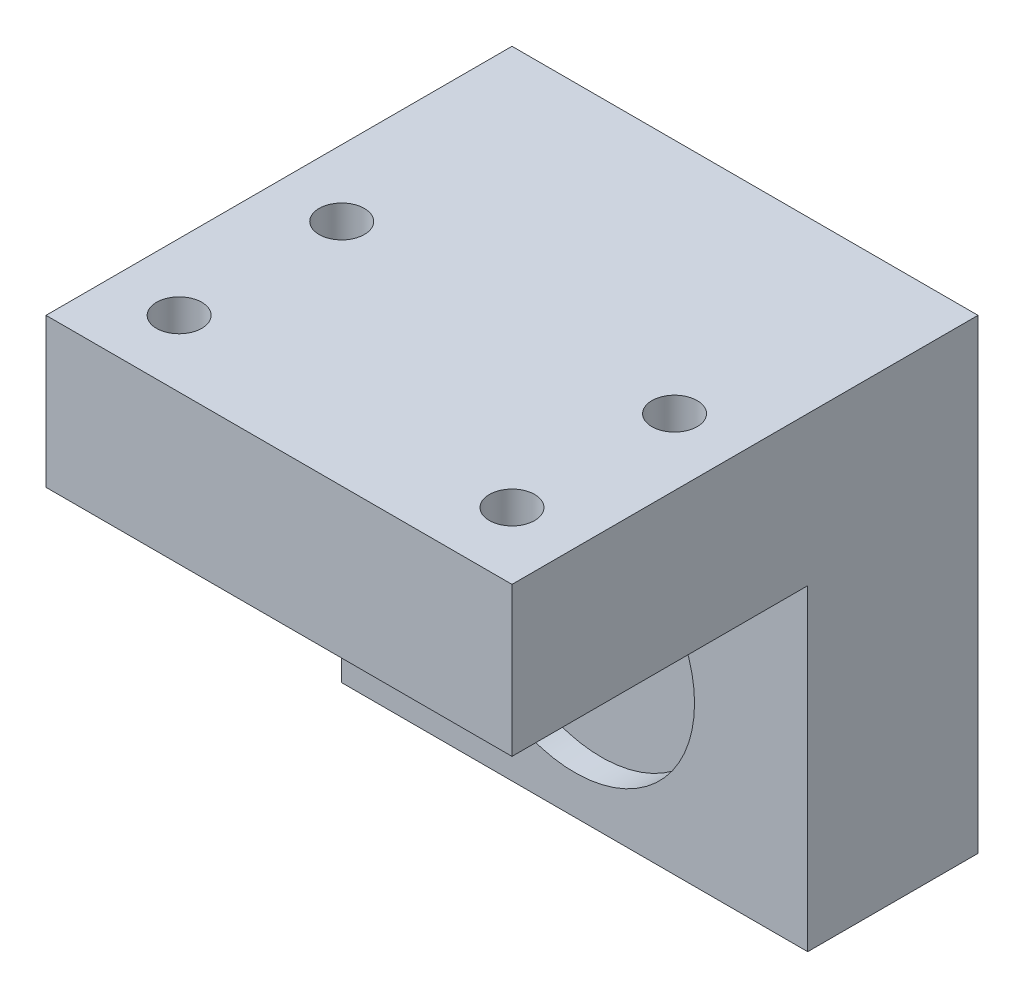
ISO-10303-21;
HEADER;
FILE_DESCRIPTION(('STEP AP214'),'2;1');
FILE_NAME('part.step','',(''),(''),'','','');
FILE_SCHEMA(('AUTOMOTIVE_DESIGN { 1 0 10303 214 1 1 1 1 }'));
ENDSEC;
DATA;
#1=APPLICATION_CONTEXT('core data for automotive mechanical design processes');
#2=APPLICATION_PROTOCOL_DEFINITION('international standard','automotive_design',2000,#1);
#3=PRODUCT_CONTEXT('',#1,'mechanical');
#4=PRODUCT('Part','Part','',(#3));
#5=PRODUCT_RELATED_PRODUCT_CATEGORY('part','',(#4));
#6=PRODUCT_DEFINITION_FORMATION('','',#4);
#7=PRODUCT_DEFINITION_CONTEXT('part definition',#1,'design');
#8=PRODUCT_DEFINITION('design','',#6,#7);
#9=PRODUCT_DEFINITION_SHAPE('','',#8);
#10=(LENGTH_UNIT() NAMED_UNIT(*) SI_UNIT(.MILLI.,.METRE.));
#11=(NAMED_UNIT(*) PLANE_ANGLE_UNIT() SI_UNIT($,.RADIAN.));
#12=(NAMED_UNIT(*) SI_UNIT($,.STERADIAN.) SOLID_ANGLE_UNIT());
#13=UNCERTAINTY_MEASURE_WITH_UNIT(LENGTH_MEASURE(1.E-05),#10,'distance_accuracy_value','');
#14=(GEOMETRIC_REPRESENTATION_CONTEXT(3) GLOBAL_UNCERTAINTY_ASSIGNED_CONTEXT((#13)) GLOBAL_UNIT_ASSIGNED_CONTEXT((#10,
#11,#12)) REPRESENTATION_CONTEXT('',''));
#15=CARTESIAN_POINT('',(0.,0.,0.));
#16=DIRECTION('',(0.,0.,1.));
#17=DIRECTION('',(1.,0.,0.));
#18=AXIS2_PLACEMENT_3D('',#15,#16,#17);
#19=CARTESIAN_POINT('',(17.5,11.905,-12.791));
#20=DIRECTION('',(0.,0.,1.));
#21=DIRECTION('',(1.,0.,0.));
#22=AXIS2_PLACEMENT_3D('',#19,#20,#21);
#23=CYLINDRICAL_SURFACE('',#22,3.);
#24=CARTESIAN_POINT('',(17.5,11.905,-12.79));
#25=DIRECTION('',(0.,0.,1.));
#26=DIRECTION('',(0.,-1.,0.));
#27=AXIS2_PLACEMENT_3D('',#24,#25,#26);
#28=CIRCLE('',#27,3.);
#29=CARTESIAN_POINT('',(17.5,8.905,-12.79));
#30=VERTEX_POINT('',#29);
#31=EDGE_CURVE('E141',#30,#30,#28,.F.);
#32=ORIENTED_EDGE('',*,*,#31,.T.);
#33=EDGE_LOOP('',(#32));
#34=FACE_BOUND('',#33,.T.);
#35=CARTESIAN_POINT('',(17.5,11.905,-2.));
#36=DIRECTION('',(0.,0.,1.));
#37=DIRECTION('',(1.,0.,0.));
#38=AXIS2_PLACEMENT_3D('',#35,#36,#37);
#39=CIRCLE('',#38,3.);
#40=CARTESIAN_POINT('',(20.5,11.905,-2.));
#41=VERTEX_POINT('',#40);
#42=EDGE_CURVE('E49',#41,#41,#39,.F.);
#43=ORIENTED_EDGE('',*,*,#42,.F.);
#44=EDGE_LOOP('',(#43));
#45=FACE_BOUND('',#44,.T.);
#46=ADVANCED_FACE('F45',(#34,#45),#23,.F.);
#47=CARTESIAN_POINT('',(35.,35.,22.21));
#48=DIRECTION('',(0.,0.,-1.));
#49=DIRECTION('',(0.,1.,0.));
#50=AXIS2_PLACEMENT_3D('',#47,#48,#49);
#51=PLANE('',#50);
#52=DIRECTION('',(0.,-1.,0.));
#53=VECTOR('',#52,1.);
#54=CARTESIAN_POINT('',(0.,35.,22.21));
#55=LINE('',#54,#53);
#56=CARTESIAN_POINT('',(0.,35.,22.21));
#57=VERTEX_POINT('',#56);
#58=CARTESIAN_POINT('',(0.,23.81,22.21));
#59=VERTEX_POINT('',#58);
#60=EDGE_CURVE('E136',#57,#59,#55,.T.);
#61=ORIENTED_EDGE('',*,*,#60,.T.);
#62=DIRECTION('',(-1.,0.,0.));
#63=VECTOR('',#62,1.);
#64=CARTESIAN_POINT('',(35.,23.81,22.21));
#65=LINE('',#64,#63);
#66=CARTESIAN_POINT('',(35.,23.81,22.21));
#67=VERTEX_POINT('',#66);
#68=EDGE_CURVE('E11',#67,#59,#65,.T.);
#69=ORIENTED_EDGE('',*,*,#68,.F.);
#70=DIRECTION('',(0.,-1.,0.));
#71=VECTOR('',#70,1.);
#72=CARTESIAN_POINT('',(35.,35.,22.21));
#73=LINE('',#72,#71);
#74=CARTESIAN_POINT('',(35.,35.,22.21));
#75=VERTEX_POINT('',#74);
#76=EDGE_CURVE('E153',#75,#67,#73,.T.);
#77=ORIENTED_EDGE('',*,*,#76,.F.);
#78=DIRECTION('',(-1.,0.,0.));
#79=VECTOR('',#78,1.);
#80=CARTESIAN_POINT('',(35.,35.,22.21));
#81=LINE('',#80,#79);
#82=EDGE_CURVE('E132',#75,#57,#81,.T.);
#83=ORIENTED_EDGE('',*,*,#82,.T.);
#84=EDGE_LOOP('',(#61,#69,#77,#83));
#85=FACE_BOUND('',#84,.T.);
#86=ADVANCED_FACE('F47',(#85),#51,.F.);
#87=CARTESIAN_POINT('',(35.,23.81,22.21));
#88=DIRECTION('',(0.,1.,0.));
#89=DIRECTION('',(0.,0.,1.));
#90=AXIS2_PLACEMENT_3D('',#87,#88,#89);
#91=PLANE('',#90);
#92=CARTESIAN_POINT('',(5.,23.81,5.00000000000001));
#93=DIRECTION('',(0.,-1.,0.));
#94=DIRECTION('',(0.,0.,-1.));
#95=AXIS2_PLACEMENT_3D('',#92,#93,#94);
#96=CIRCLE('',#95,1.7);
#97=CARTESIAN_POINT('',(5.,23.81,3.30000000000001));
#98=VERTEX_POINT('',#97);
#99=EDGE_CURVE('E250',#98,#98,#96,.T.);
#100=ORIENTED_EDGE('',*,*,#99,.F.);
#101=EDGE_LOOP('',(#100));
#102=FACE_BOUND('',#101,.T.);
#103=CARTESIAN_POINT('',(30.,23.81,5.00000000000001));
#104=DIRECTION('',(0.,-1.,0.));
#105=DIRECTION('',(0.,0.,-1.));
#106=AXIS2_PLACEMENT_3D('',#103,#104,#105);
#107=CIRCLE('',#106,1.69999999999999);
#108=CARTESIAN_POINT('',(30.,23.81,3.30000000000002));
#109=VERTEX_POINT('',#108);
#110=EDGE_CURVE('E238',#109,#109,#107,.T.);
#111=ORIENTED_EDGE('',*,*,#110,.F.);
#112=EDGE_LOOP('',(#111));
#113=FACE_BOUND('',#112,.T.);
#114=CARTESIAN_POINT('',(30.,23.81,17.21));
#115=DIRECTION('',(0.,-1.,0.));
#116=DIRECTION('',(0.,0.,-1.));
#117=AXIS2_PLACEMENT_3D('',#114,#115,#116);
#118=CIRCLE('',#117,1.7);
#119=CARTESIAN_POINT('',(30.,23.81,15.51));
#120=VERTEX_POINT('',#119);
#121=EDGE_CURVE('E232',#120,#120,#118,.T.);
#122=ORIENTED_EDGE('',*,*,#121,.F.);
#123=EDGE_LOOP('',(#122));
#124=FACE_BOUND('',#123,.T.);
#125=CARTESIAN_POINT('',(5.,23.81,17.21));
#126=DIRECTION('',(0.,-1.,0.));
#127=DIRECTION('',(0.,0.,-1.));
#128=AXIS2_PLACEMENT_3D('',#125,#126,#127);
#129=CIRCLE('',#128,1.7);
#130=CARTESIAN_POINT('',(5.,23.81,15.51));
#131=VERTEX_POINT('',#130);
#132=EDGE_CURVE('E242',#131,#131,#129,.T.);
#133=ORIENTED_EDGE('',*,*,#132,.F.);
#134=EDGE_LOOP('',(#133));
#135=FACE_BOUND('',#134,.T.);
#136=DIRECTION('',(0.,0.,-1.));
#137=VECTOR('',#136,1.);
#138=CARTESIAN_POINT('',(0.,23.81,22.21));
#139=LINE('',#138,#137);
#140=CARTESIAN_POINT('',(0.,23.81,0.));
#141=VERTEX_POINT('',#140);
#142=EDGE_CURVE('E140',#59,#141,#139,.T.);
#143=ORIENTED_EDGE('',*,*,#142,.T.);
#144=DIRECTION('',(-1.,0.,0.));
#145=VECTOR('',#144,1.);
#146=CARTESIAN_POINT('',(35.,23.81,0.));
#147=LINE('',#146,#145);
#148=CARTESIAN_POINT('',(35.,23.81,0.));
#149=VERTEX_POINT('',#148);
#150=EDGE_CURVE('E56',#149,#141,#147,.T.);
#151=ORIENTED_EDGE('',*,*,#150,.F.);
#152=DIRECTION('',(0.,0.,-1.));
#153=VECTOR('',#152,1.);
#154=CARTESIAN_POINT('',(35.,23.81,22.21));
#155=LINE('',#154,#153);
#156=EDGE_CURVE('E101',#67,#149,#155,.T.);
#157=ORIENTED_EDGE('',*,*,#156,.F.);
#158=ORIENTED_EDGE('',*,*,#68,.T.);
#159=EDGE_LOOP('',(#143,#151,#157,#158));
#160=FACE_BOUND('',#159,.T.);
#161=ADVANCED_FACE('F194',(#102,#113,#124,#135,#160),#91,.F.);
#162=CARTESIAN_POINT('',(35.,23.81,0.));
#163=DIRECTION('',(0.,0.,-1.));
#164=DIRECTION('',(0.,1.,0.));
#165=AXIS2_PLACEMENT_3D('',#162,#163,#164);
#166=PLANE('',#165);
#167=CARTESIAN_POINT('',(17.5,11.905,0.));
#168=DIRECTION('',(0.,0.,1.));
#169=DIRECTION('',(1.,0.,0.));
#170=AXIS2_PLACEMENT_3D('',#167,#168,#169);
#171=CIRCLE('',#170,9.);
#172=CARTESIAN_POINT('',(26.5,11.905,0.));
#173=VERTEX_POINT('',#172);
#174=EDGE_CURVE('E266',#173,#173,#171,.T.);
#175=ORIENTED_EDGE('',*,*,#174,.F.);
#176=EDGE_LOOP('',(#175));
#177=FACE_BOUND('',#176,.T.);
#178=DIRECTION('',(0.,-1.,0.));
#179=VECTOR('',#178,1.);
#180=CARTESIAN_POINT('',(0.,23.81,0.));
#181=LINE('',#180,#179);
#182=CARTESIAN_POINT('',(0.,0.,0.));
#183=VERTEX_POINT('',#182);
#184=EDGE_CURVE('E144',#141,#183,#181,.T.);
#185=ORIENTED_EDGE('',*,*,#184,.T.);
#186=DIRECTION('',(-1.,0.,0.));
#187=VECTOR('',#186,1.);
#188=CARTESIAN_POINT('',(35.,0.,0.));
#189=LINE('',#188,#187);
#190=CARTESIAN_POINT('',(35.,0.,0.));
#191=VERTEX_POINT('',#190);
#192=EDGE_CURVE('E125',#191,#183,#189,.T.);
#193=ORIENTED_EDGE('',*,*,#192,.F.);
#194=DIRECTION('',(0.,-1.,0.));
#195=VECTOR('',#194,1.);
#196=CARTESIAN_POINT('',(35.,23.81,0.));
#197=LINE('',#196,#195);
#198=EDGE_CURVE('E114',#149,#191,#197,.T.);
#199=ORIENTED_EDGE('',*,*,#198,.F.);
#200=ORIENTED_EDGE('',*,*,#150,.T.);
#201=EDGE_LOOP('',(#185,#193,#199,#200));
#202=FACE_BOUND('',#201,.T.);
#203=ADVANCED_FACE('F164',(#177,#202),#166,.F.);
#204=CARTESIAN_POINT('',(35.,0.,0.));
#205=DIRECTION('',(0.,1.,0.));
#206=DIRECTION('',(0.,0.,1.));
#207=AXIS2_PLACEMENT_3D('',#204,#205,#206);
#208=PLANE('',#207);
#209=DIRECTION('',(0.,0.,-1.));
#210=VECTOR('',#209,1.);
#211=CARTESIAN_POINT('',(0.,0.,0.));
#212=LINE('',#211,#210);
#213=CARTESIAN_POINT('',(0.,0.,-12.79));
#214=VERTEX_POINT('',#213);
#215=EDGE_CURVE('E123',#183,#214,#212,.T.);
#216=ORIENTED_EDGE('',*,*,#215,.T.);
#217=DIRECTION('',(-1.,0.,0.));
#218=VECTOR('',#217,1.);
#219=CARTESIAN_POINT('',(35.,0.,-12.79));
#220=LINE('',#219,#218);
#221=CARTESIAN_POINT('',(35.,0.,-12.79));
#222=VERTEX_POINT('',#221);
#223=EDGE_CURVE('E120',#222,#214,#220,.T.);
#224=ORIENTED_EDGE('',*,*,#223,.F.);
#225=DIRECTION('',(0.,0.,-1.));
#226=VECTOR('',#225,1.);
#227=CARTESIAN_POINT('',(35.,0.,0.));
#228=LINE('',#227,#226);
#229=EDGE_CURVE('E108',#191,#222,#228,.T.);
#230=ORIENTED_EDGE('',*,*,#229,.F.);
#231=ORIENTED_EDGE('',*,*,#192,.T.);
#232=EDGE_LOOP('',(#216,#224,#230,#231));
#233=FACE_BOUND('',#232,.T.);
#234=ADVANCED_FACE('F121',(#233),#208,.F.);
#235=CARTESIAN_POINT('',(35.,0.,-12.79));
#236=DIRECTION('',(0.,0.,1.));
#237=DIRECTION('',(0.,-1.,0.));
#238=AXIS2_PLACEMENT_3D('',#235,#236,#237);
#239=PLANE('',#238);
#240=ORIENTED_EDGE('',*,*,#31,.F.);
#241=EDGE_LOOP('',(#240));
#242=FACE_BOUND('',#241,.T.);
#243=DIRECTION('',(0.,1.,0.));
#244=VECTOR('',#243,1.);
#245=CARTESIAN_POINT('',(0.,0.,-12.79));
#246=LINE('',#245,#244);
#247=CARTESIAN_POINT('',(0.,35.,-12.79));
#248=VERTEX_POINT('',#247);
#249=EDGE_CURVE('E87',#214,#248,#246,.T.);
#250=ORIENTED_EDGE('',*,*,#249,.T.);
#251=DIRECTION('',(-1.,0.,0.));
#252=VECTOR('',#251,1.);
#253=CARTESIAN_POINT('',(35.,35.,-12.79));
#254=LINE('',#253,#252);
#255=CARTESIAN_POINT('',(35.,35.,-12.79));
#256=VERTEX_POINT('',#255);
#257=EDGE_CURVE('E126',#256,#248,#254,.T.);
#258=ORIENTED_EDGE('',*,*,#257,.F.);
#259=DIRECTION('',(0.,1.,0.));
#260=VECTOR('',#259,1.);
#261=CARTESIAN_POINT('',(35.,0.,-12.79));
#262=LINE('',#261,#260);
#263=EDGE_CURVE('E112',#222,#256,#262,.T.);
#264=ORIENTED_EDGE('',*,*,#263,.F.);
#265=ORIENTED_EDGE('',*,*,#223,.T.);
#266=EDGE_LOOP('',(#250,#258,#264,#265));
#267=FACE_BOUND('',#266,.T.);
#268=ADVANCED_FACE('F128',(#242,#267),#239,.F.);
#269=CARTESIAN_POINT('',(35.,35.,-12.79));
#270=DIRECTION('',(0.,-1.,0.));
#271=DIRECTION('',(0.,0.,-1.));
#272=AXIS2_PLACEMENT_3D('',#269,#270,#271);
#273=PLANE('',#272);
#274=CARTESIAN_POINT('',(5.,35.,5.00000000000001));
#275=DIRECTION('',(0.,-1.,0.));
#276=DIRECTION('',(0.,0.,-1.));
#277=AXIS2_PLACEMENT_3D('',#274,#275,#276);
#278=CIRCLE('',#277,1.7);
#279=CARTESIAN_POINT('',(5.,35.,3.30000000000001));
#280=VERTEX_POINT('',#279);
#281=EDGE_CURVE('E252',#280,#280,#278,.F.);
#282=ORIENTED_EDGE('',*,*,#281,.F.);
#283=EDGE_LOOP('',(#282));
#284=FACE_BOUND('',#283,.T.);
#285=CARTESIAN_POINT('',(30.,35.,5.00000000000001));
#286=DIRECTION('',(0.,-1.,0.));
#287=DIRECTION('',(0.,0.,-1.));
#288=AXIS2_PLACEMENT_3D('',#285,#286,#287);
#289=CIRCLE('',#288,1.69999999999999);
#290=CARTESIAN_POINT('',(30.,35.,3.30000000000002));
#291=VERTEX_POINT('',#290);
#292=EDGE_CURVE('E245',#291,#291,#289,.F.);
#293=ORIENTED_EDGE('',*,*,#292,.F.);
#294=EDGE_LOOP('',(#293));
#295=FACE_BOUND('',#294,.T.);
#296=CARTESIAN_POINT('',(30.,35.,17.21));
#297=DIRECTION('',(0.,-1.,0.));
#298=DIRECTION('',(0.,0.,-1.));
#299=AXIS2_PLACEMENT_3D('',#296,#297,#298);
#300=CIRCLE('',#299,1.7);
#301=CARTESIAN_POINT('',(30.,35.,15.51));
#302=VERTEX_POINT('',#301);
#303=EDGE_CURVE('E235',#302,#302,#300,.F.);
#304=ORIENTED_EDGE('',*,*,#303,.F.);
#305=EDGE_LOOP('',(#304));
#306=FACE_BOUND('',#305,.T.);
#307=CARTESIAN_POINT('',(5.,35.,17.21));
#308=DIRECTION('',(0.,-1.,0.));
#309=DIRECTION('',(0.,0.,-1.));
#310=AXIS2_PLACEMENT_3D('',#307,#308,#309);
#311=CIRCLE('',#310,1.7);
#312=CARTESIAN_POINT('',(5.,35.,15.51));
#313=VERTEX_POINT('',#312);
#314=EDGE_CURVE('E262',#313,#313,#311,.F.);
#315=ORIENTED_EDGE('',*,*,#314,.F.);
#316=EDGE_LOOP('',(#315));
#317=FACE_BOUND('',#316,.T.);
#318=DIRECTION('',(0.,0.,1.));
#319=VECTOR('',#318,1.);
#320=CARTESIAN_POINT('',(0.,35.,-12.79));
#321=LINE('',#320,#319);
#322=EDGE_CURVE('E93',#248,#57,#321,.T.);
#323=ORIENTED_EDGE('',*,*,#322,.T.);
#324=ORIENTED_EDGE('',*,*,#82,.F.);
#325=DIRECTION('',(0.,0.,1.));
#326=VECTOR('',#325,1.);
#327=CARTESIAN_POINT('',(35.,35.,-12.79));
#328=LINE('',#327,#326);
#329=EDGE_CURVE('E64',#256,#75,#328,.T.);
#330=ORIENTED_EDGE('',*,*,#329,.F.);
#331=ORIENTED_EDGE('',*,*,#257,.T.);
#332=EDGE_LOOP('',(#323,#324,#330,#331));
#333=FACE_BOUND('',#332,.T.);
#334=ADVANCED_FACE('F171',(#284,#295,#306,#317,#333),#273,.F.);
#335=CARTESIAN_POINT('',(35.,0.,0.));
#336=DIRECTION('',(1.,0.,0.));
#337=DIRECTION('',(0.,0.,-1.));
#338=AXIS2_PLACEMENT_3D('',#335,#336,#337);
#339=PLANE('',#338);
#340=ORIENTED_EDGE('',*,*,#76,.T.);
#341=ORIENTED_EDGE('',*,*,#156,.T.);
#342=ORIENTED_EDGE('',*,*,#198,.T.);
#343=ORIENTED_EDGE('',*,*,#229,.T.);
#344=ORIENTED_EDGE('',*,*,#263,.T.);
#345=ORIENTED_EDGE('',*,*,#329,.T.);
#346=EDGE_LOOP('',(#340,#341,#342,#343,#344,#345));
#347=FACE_BOUND('',#346,.T.);
#348=ADVANCED_FACE('F110',(#347),#339,.T.);
#349=CARTESIAN_POINT('',(0.,0.,0.));
#350=DIRECTION('',(1.,0.,0.));
#351=DIRECTION('',(0.,0.,-1.));
#352=AXIS2_PLACEMENT_3D('',#349,#350,#351);
#353=PLANE('',#352);
#354=ORIENTED_EDGE('',*,*,#60,.F.);
#355=ORIENTED_EDGE('',*,*,#322,.F.);
#356=ORIENTED_EDGE('',*,*,#249,.F.);
#357=ORIENTED_EDGE('',*,*,#215,.F.);
#358=ORIENTED_EDGE('',*,*,#184,.F.);
#359=ORIENTED_EDGE('',*,*,#142,.F.);
#360=EDGE_LOOP('',(#354,#355,#356,#357,#358,#359));
#361=FACE_BOUND('',#360,.T.);
#362=ADVANCED_FACE('F167',(#361),#353,.F.);
#363=CARTESIAN_POINT('',(17.5,11.905,-2.));
#364=DIRECTION('',(0.,0.,1.));
#365=DIRECTION('',(1.,0.,0.));
#366=AXIS2_PLACEMENT_3D('',#363,#364,#365);
#367=PLANE('',#366);
#368=CARTESIAN_POINT('',(17.5,11.905,-2.));
#369=DIRECTION('',(0.,0.,1.));
#370=DIRECTION('',(1.,0.,0.));
#371=AXIS2_PLACEMENT_3D('',#368,#369,#370);
#372=CIRCLE('',#371,9.);
#373=CARTESIAN_POINT('',(26.5,11.905,-2.));
#374=VERTEX_POINT('',#373);
#375=EDGE_CURVE('E267',#374,#374,#372,.T.);
#376=ORIENTED_EDGE('',*,*,#375,.T.);
#377=EDGE_LOOP('',(#376));
#378=FACE_BOUND('',#377,.T.);
#379=ORIENTED_EDGE('',*,*,#42,.T.);
#380=EDGE_LOOP('',(#379));
#381=FACE_BOUND('',#380,.T.);
#382=ADVANCED_FACE('F201',(#378,#381),#367,.T.);
#383=CARTESIAN_POINT('',(17.5,11.905,-2.));
#384=DIRECTION('',(0.,0.,1.));
#385=DIRECTION('',(1.,0.,0.));
#386=AXIS2_PLACEMENT_3D('',#383,#384,#385);
#387=CYLINDRICAL_SURFACE('',#386,9.);
#388=ORIENTED_EDGE('',*,*,#375,.F.);
#389=EDGE_LOOP('',(#388));
#390=FACE_BOUND('',#389,.T.);
#391=ORIENTED_EDGE('',*,*,#174,.T.);
#392=EDGE_LOOP('',(#391));
#393=FACE_BOUND('',#392,.T.);
#394=ADVANCED_FACE('F198',(#390,#393),#387,.F.);
#395=CARTESIAN_POINT('',(5.,35.001,17.21));
#396=DIRECTION('',(0.,-1.,0.));
#397=DIRECTION('',(0.,0.,-1.));
#398=AXIS2_PLACEMENT_3D('',#395,#396,#397);
#399=CYLINDRICAL_SURFACE('',#398,1.7);
#400=ORIENTED_EDGE('',*,*,#132,.T.);
#401=EDGE_LOOP('',(#400));
#402=FACE_BOUND('',#401,.T.);
#403=ORIENTED_EDGE('',*,*,#314,.T.);
#404=EDGE_LOOP('',(#403));
#405=FACE_BOUND('',#404,.T.);
#406=ADVANCED_FACE('F209',(#402,#405),#399,.F.);
#407=CARTESIAN_POINT('',(30.,35.001,17.21));
#408=DIRECTION('',(0.,-1.,0.));
#409=DIRECTION('',(0.,0.,-1.));
#410=AXIS2_PLACEMENT_3D('',#407,#408,#409);
#411=CYLINDRICAL_SURFACE('',#410,1.7);
#412=ORIENTED_EDGE('',*,*,#121,.T.);
#413=EDGE_LOOP('',(#412));
#414=FACE_BOUND('',#413,.T.);
#415=ORIENTED_EDGE('',*,*,#303,.T.);
#416=EDGE_LOOP('',(#415));
#417=FACE_BOUND('',#416,.T.);
#418=ADVANCED_FACE('F215',(#414,#417),#411,.F.);
#419=CARTESIAN_POINT('',(30.,35.001,5.00000000000001));
#420=DIRECTION('',(0.,-1.,0.));
#421=DIRECTION('',(0.,0.,-1.));
#422=AXIS2_PLACEMENT_3D('',#419,#420,#421);
#423=CYLINDRICAL_SURFACE('',#422,1.69999999999999);
#424=ORIENTED_EDGE('',*,*,#110,.T.);
#425=EDGE_LOOP('',(#424));
#426=FACE_BOUND('',#425,.T.);
#427=ORIENTED_EDGE('',*,*,#292,.T.);
#428=EDGE_LOOP('',(#427));
#429=FACE_BOUND('',#428,.T.);
#430=ADVANCED_FACE('F220',(#426,#429),#423,.F.);
#431=CARTESIAN_POINT('',(5.,35.001,5.00000000000001));
#432=DIRECTION('',(0.,-1.,0.));
#433=DIRECTION('',(0.,0.,-1.));
#434=AXIS2_PLACEMENT_3D('',#431,#432,#433);
#435=CYLINDRICAL_SURFACE('',#434,1.7);
#436=ORIENTED_EDGE('',*,*,#99,.T.);
#437=EDGE_LOOP('',(#436));
#438=FACE_BOUND('',#437,.T.);
#439=ORIENTED_EDGE('',*,*,#281,.T.);
#440=EDGE_LOOP('',(#439));
#441=FACE_BOUND('',#440,.T.);
#442=ADVANCED_FACE('F217',(#438,#441),#435,.F.);
#443=CLOSED_SHELL('',(#46,#86,#161,#203,#234,#268,#334,#348,#362,#382,#394,#406,#418,#430,#442));
#444=MANIFOLD_SOLID_BREP('B2',#443);
#445=ADVANCED_BREP_SHAPE_REPRESENTATION('',(#18,#444),#14);
#446=SHAPE_DEFINITION_REPRESENTATION(#9,#445);
ENDSEC;
END-ISO-10303-21;
